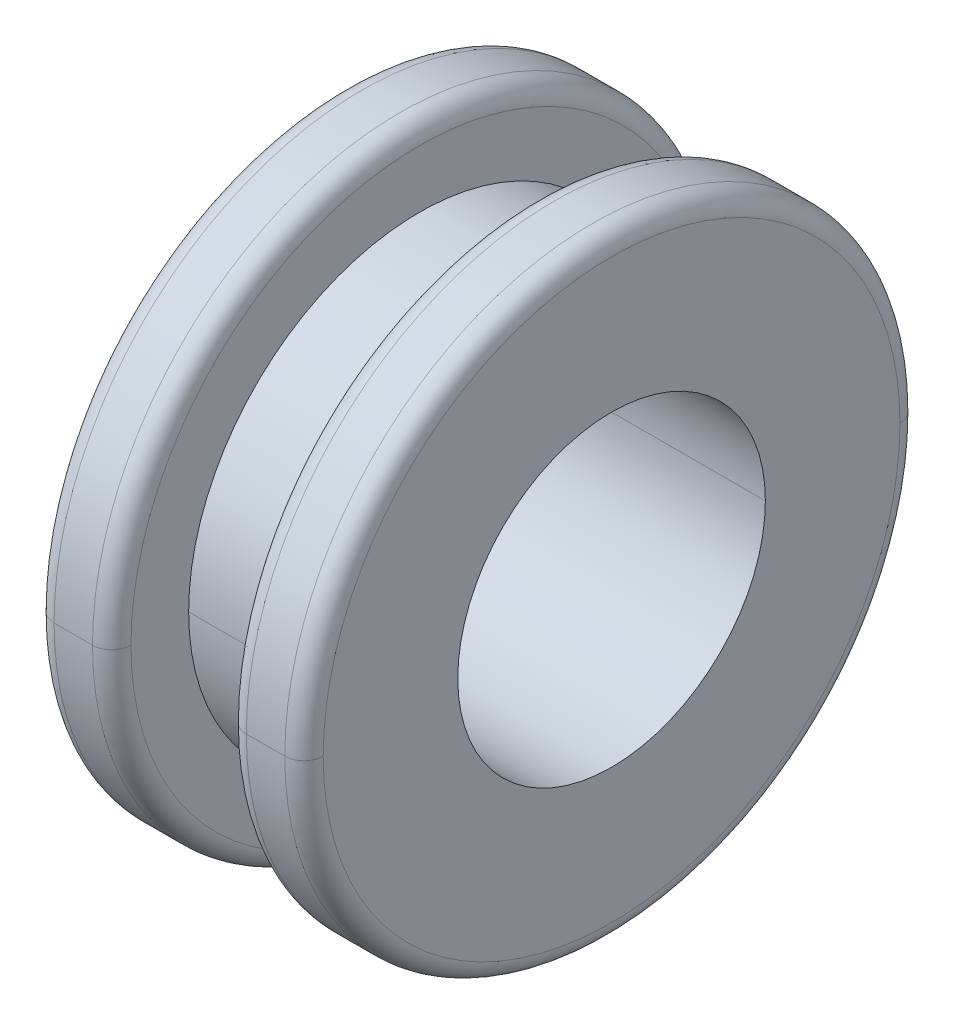
ISO-10303-21;
HEADER;
FILE_DESCRIPTION(('STEP AP214'),'2;1');
FILE_NAME('part.step','',(''),(''),'','','');
FILE_SCHEMA(('AUTOMOTIVE_DESIGN { 1 0 10303 214 1 1 1 1 }'));
ENDSEC;
DATA;
#1=APPLICATION_CONTEXT('core data for automotive mechanical design processes');
#2=APPLICATION_PROTOCOL_DEFINITION('international standard','automotive_design',2000,#1);
#3=PRODUCT_CONTEXT('',#1,'mechanical');
#4=PRODUCT('Part','Part','',(#3));
#5=PRODUCT_RELATED_PRODUCT_CATEGORY('part','',(#4));
#6=PRODUCT_DEFINITION_FORMATION('','',#4);
#7=PRODUCT_DEFINITION_CONTEXT('part definition',#1,'design');
#8=PRODUCT_DEFINITION('design','',#6,#7);
#9=PRODUCT_DEFINITION_SHAPE('','',#8);
#10=(LENGTH_UNIT() NAMED_UNIT(*) SI_UNIT(.MILLI.,.METRE.));
#11=(NAMED_UNIT(*) PLANE_ANGLE_UNIT() SI_UNIT($,.RADIAN.));
#12=(NAMED_UNIT(*) SI_UNIT($,.STERADIAN.) SOLID_ANGLE_UNIT());
#13=UNCERTAINTY_MEASURE_WITH_UNIT(LENGTH_MEASURE(1.E-05),#10,'distance_accuracy_value','');
#14=(GEOMETRIC_REPRESENTATION_CONTEXT(3) GLOBAL_UNCERTAINTY_ASSIGNED_CONTEXT((#13)) GLOBAL_UNIT_ASSIGNED_CONTEXT((#10,
#11,#12)) REPRESENTATION_CONTEXT('',''));
#15=CARTESIAN_POINT('',(0.,0.,0.));
#16=DIRECTION('',(0.,0.,1.));
#17=DIRECTION('',(1.,0.,0.));
#18=AXIS2_PLACEMENT_3D('',#15,#16,#17);
#19=CARTESIAN_POINT('',(3.5,0.,0.));
#20=DIRECTION('',(-1.,0.,0.));
#21=DIRECTION('',(0.,0.,1.));
#22=AXIS2_PLACEMENT_3D('',#19,#20,#21);
#23=CYLINDRICAL_SURFACE('',#22,4.);
#24=DIRECTION('',(-1.,0.,0.));
#25=VECTOR('',#24,1.);
#26=CARTESIAN_POINT('',(3.5,0.,-4.));
#27=LINE('',#26,#25);
#28=CARTESIAN_POINT('',(3.5,0.,-4.));
#29=VERTEX_POINT('',#28);
#30=CARTESIAN_POINT('',(-3.5,0.,-4.));
#31=VERTEX_POINT('',#30);
#32=EDGE_CURVE('E208',#29,#31,#27,.T.);
#33=ORIENTED_EDGE('',*,*,#32,.F.);
#34=CARTESIAN_POINT('',(3.5,0.,0.));
#35=DIRECTION('',(-1.,0.,0.));
#36=DIRECTION('',(0.,0.,1.));
#37=AXIS2_PLACEMENT_3D('',#34,#35,#36);
#38=CIRCLE('',#37,4.);
#39=CARTESIAN_POINT('',(3.5,0.,4.));
#40=VERTEX_POINT('',#39);
#41=EDGE_CURVE('E197',#40,#29,#38,.T.);
#42=ORIENTED_EDGE('',*,*,#41,.F.);
#43=DIRECTION('',(-1.,0.,0.));
#44=VECTOR('',#43,1.);
#45=CARTESIAN_POINT('',(3.5,0.,4.));
#46=LINE('',#45,#44);
#47=CARTESIAN_POINT('',(-3.5,0.,4.));
#48=VERTEX_POINT('',#47);
#49=EDGE_CURVE('E216',#40,#48,#46,.T.);
#50=ORIENTED_EDGE('',*,*,#49,.T.);
#51=CARTESIAN_POINT('',(-3.5,0.,0.));
#52=DIRECTION('',(-1.,0.,0.));
#53=DIRECTION('',(0.,0.,1.));
#54=AXIS2_PLACEMENT_3D('',#51,#52,#53);
#55=CIRCLE('',#54,4.);
#56=EDGE_CURVE('E196',#48,#31,#55,.T.);
#57=ORIENTED_EDGE('',*,*,#56,.T.);
#58=EDGE_LOOP('',(#33,#42,#50,#57));
#59=FACE_BOUND('',#58,.T.);
#60=ADVANCED_FACE('F16',(#59),#23,.F.);
#61=CARTESIAN_POINT('',(3.,0.,0.));
#62=DIRECTION('',(-1.,0.,0.));
#63=DIRECTION('',(0.,0.,1.));
#64=AXIS2_PLACEMENT_3D('',#61,#62,#63);
#65=TOROIDAL_SURFACE('',#64,7.5,0.5);
#66=CARTESIAN_POINT('',(3.,0.,-7.5));
#67=DIRECTION('',(0.,1.,0.));
#68=DIRECTION('',(0.,0.,1.));
#69=AXIS2_PLACEMENT_3D('',#66,#67,#68);
#70=CIRCLE('',#69,0.5);
#71=CARTESIAN_POINT('',(3.5,0.,-7.5));
#72=VERTEX_POINT('',#71);
#73=CARTESIAN_POINT('',(3.,0.,-8.));
#74=VERTEX_POINT('',#73);
#75=EDGE_CURVE('E266',#72,#74,#70,.T.);
#76=ORIENTED_EDGE('',*,*,#75,.F.);
#77=CARTESIAN_POINT('',(3.5,0.,0.));
#78=DIRECTION('',(1.,0.,0.));
#79=DIRECTION('',(0.,0.,1.));
#80=AXIS2_PLACEMENT_3D('',#77,#78,#79);
#81=CIRCLE('',#80,7.5);
#82=CARTESIAN_POINT('',(3.5,0.,7.5));
#83=VERTEX_POINT('',#82);
#84=EDGE_CURVE('E240',#83,#72,#81,.T.);
#85=ORIENTED_EDGE('',*,*,#84,.F.);
#86=CARTESIAN_POINT('',(3.,0.,7.5));
#87=DIRECTION('',(0.,-1.,0.));
#88=DIRECTION('',(0.,0.,-1.));
#89=AXIS2_PLACEMENT_3D('',#86,#87,#88);
#90=CIRCLE('',#89,0.5);
#91=CARTESIAN_POINT('',(3.,0.,8.));
#92=VERTEX_POINT('',#91);
#93=EDGE_CURVE('E265',#83,#92,#90,.T.);
#94=ORIENTED_EDGE('',*,*,#93,.T.);
#95=CARTESIAN_POINT('',(3.,0.,0.));
#96=DIRECTION('',(-1.,0.,0.));
#97=DIRECTION('',(0.,0.,1.));
#98=AXIS2_PLACEMENT_3D('',#95,#96,#97);
#99=CIRCLE('',#98,8.);
#100=EDGE_CURVE('E26',#74,#92,#99,.T.);
#101=ORIENTED_EDGE('',*,*,#100,.F.);
#102=EDGE_LOOP('',(#76,#85,#94,#101));
#103=FACE_BOUND('',#102,.T.);
#104=ADVANCED_FACE('F576',(#103),#65,.T.);
#105=CARTESIAN_POINT('',(2.,0.,0.));
#106=DIRECTION('',(1.,0.,0.));
#107=DIRECTION('',(0.,0.,-1.));
#108=AXIS2_PLACEMENT_3D('',#105,#106,#107);
#109=TOROIDAL_SURFACE('',#108,7.5,0.5);
#110=CARTESIAN_POINT('',(2.,0.,7.5));
#111=DIRECTION('',(0.,1.,0.));
#112=DIRECTION('',(0.,0.,1.));
#113=AXIS2_PLACEMENT_3D('',#110,#111,#112);
#114=CIRCLE('',#113,0.5);
#115=CARTESIAN_POINT('',(1.5,0.,7.5));
#116=VERTEX_POINT('',#115);
#117=CARTESIAN_POINT('',(2.,0.,8.));
#118=VERTEX_POINT('',#117);
#119=EDGE_CURVE('E173',#116,#118,#114,.T.);
#120=ORIENTED_EDGE('',*,*,#119,.F.);
#121=CARTESIAN_POINT('',(1.5,0.,0.));
#122=DIRECTION('',(-1.,0.,0.));
#123=DIRECTION('',(0.,0.,-1.));
#124=AXIS2_PLACEMENT_3D('',#121,#122,#123);
#125=CIRCLE('',#124,7.5);
#126=CARTESIAN_POINT('',(1.5,0.,-7.5));
#127=VERTEX_POINT('',#126);
#128=EDGE_CURVE('E165',#127,#116,#125,.T.);
#129=ORIENTED_EDGE('',*,*,#128,.F.);
#130=CARTESIAN_POINT('',(2.,0.,-7.5));
#131=DIRECTION('',(0.,-1.,0.));
#132=DIRECTION('',(0.,0.,-1.));
#133=AXIS2_PLACEMENT_3D('',#130,#131,#132);
#134=CIRCLE('',#133,0.5);
#135=CARTESIAN_POINT('',(2.,0.,-8.));
#136=VERTEX_POINT('',#135);
#137=EDGE_CURVE('E163',#127,#136,#134,.T.);
#138=ORIENTED_EDGE('',*,*,#137,.T.);
#139=CARTESIAN_POINT('',(2.,0.,0.));
#140=DIRECTION('',(1.,0.,0.));
#141=DIRECTION('',(0.,0.,-1.));
#142=AXIS2_PLACEMENT_3D('',#139,#140,#141);
#143=CIRCLE('',#142,8.);
#144=EDGE_CURVE('E10',#118,#136,#143,.T.);
#145=ORIENTED_EDGE('',*,*,#144,.F.);
#146=EDGE_LOOP('',(#120,#129,#138,#145));
#147=FACE_BOUND('',#146,.T.);
#148=ADVANCED_FACE('F164',(#147),#109,.T.);
#149=CARTESIAN_POINT('',(-2.,0.,0.));
#150=DIRECTION('',(-1.,0.,0.));
#151=DIRECTION('',(0.,0.,1.));
#152=AXIS2_PLACEMENT_3D('',#149,#150,#151);
#153=TOROIDAL_SURFACE('',#152,7.5,0.5);
#154=CARTESIAN_POINT('',(-2.,0.,-7.5));
#155=DIRECTION('',(0.,1.,0.));
#156=DIRECTION('',(0.,0.,1.));
#157=AXIS2_PLACEMENT_3D('',#154,#155,#156);
#158=CIRCLE('',#157,0.5);
#159=CARTESIAN_POINT('',(-1.5,0.,-7.5));
#160=VERTEX_POINT('',#159);
#161=CARTESIAN_POINT('',(-2.,0.,-8.));
#162=VERTEX_POINT('',#161);
#163=EDGE_CURVE('E253',#160,#162,#158,.T.);
#164=ORIENTED_EDGE('',*,*,#163,.F.);
#165=CARTESIAN_POINT('',(-1.5,0.,0.));
#166=DIRECTION('',(1.,0.,0.));
#167=DIRECTION('',(0.,0.,1.));
#168=AXIS2_PLACEMENT_3D('',#165,#166,#167);
#169=CIRCLE('',#168,7.5);
#170=CARTESIAN_POINT('',(-1.5,0.,7.5));
#171=VERTEX_POINT('',#170);
#172=EDGE_CURVE('E284',#171,#160,#169,.T.);
#173=ORIENTED_EDGE('',*,*,#172,.F.);
#174=CARTESIAN_POINT('',(-2.,0.,7.5));
#175=DIRECTION('',(0.,-1.,0.));
#176=DIRECTION('',(0.,0.,-1.));
#177=AXIS2_PLACEMENT_3D('',#174,#175,#176);
#178=CIRCLE('',#177,0.5);
#179=CARTESIAN_POINT('',(-2.,0.,8.));
#180=VERTEX_POINT('',#179);
#181=EDGE_CURVE('E183',#171,#180,#178,.T.);
#182=ORIENTED_EDGE('',*,*,#181,.T.);
#183=CARTESIAN_POINT('',(-2.,0.,0.));
#184=DIRECTION('',(-1.,0.,0.));
#185=DIRECTION('',(0.,0.,1.));
#186=AXIS2_PLACEMENT_3D('',#183,#184,#185);
#187=CIRCLE('',#186,8.);
#188=EDGE_CURVE('E203',#162,#180,#187,.T.);
#189=ORIENTED_EDGE('',*,*,#188,.F.);
#190=EDGE_LOOP('',(#164,#173,#182,#189));
#191=FACE_BOUND('',#190,.T.);
#192=ADVANCED_FACE('F604',(#191),#153,.T.);
#193=CARTESIAN_POINT('',(-3.,0.,0.));
#194=DIRECTION('',(1.,0.,0.));
#195=DIRECTION('',(0.,0.,-1.));
#196=AXIS2_PLACEMENT_3D('',#193,#194,#195);
#197=TOROIDAL_SURFACE('',#196,7.5,0.5);
#198=CARTESIAN_POINT('',(-3.,0.,7.5));
#199=DIRECTION('',(0.,1.,0.));
#200=DIRECTION('',(0.,0.,1.));
#201=AXIS2_PLACEMENT_3D('',#198,#199,#200);
#202=CIRCLE('',#201,0.5);
#203=CARTESIAN_POINT('',(-3.5,0.,7.5));
#204=VERTEX_POINT('',#203);
#205=CARTESIAN_POINT('',(-3.,0.,8.));
#206=VERTEX_POINT('',#205);
#207=EDGE_CURVE('E222',#204,#206,#202,.T.);
#208=ORIENTED_EDGE('',*,*,#207,.F.);
#209=CARTESIAN_POINT('',(-3.5,0.,0.));
#210=DIRECTION('',(-1.,0.,0.));
#211=DIRECTION('',(0.,0.,-1.));
#212=AXIS2_PLACEMENT_3D('',#209,#210,#211);
#213=CIRCLE('',#212,7.5);
#214=CARTESIAN_POINT('',(-3.5,0.,-7.5));
#215=VERTEX_POINT('',#214);
#216=EDGE_CURVE('E125',#215,#204,#213,.T.);
#217=ORIENTED_EDGE('',*,*,#216,.F.);
#218=CARTESIAN_POINT('',(-3.,0.,-7.5));
#219=DIRECTION('',(0.,-1.,0.));
#220=DIRECTION('',(0.,0.,-1.));
#221=AXIS2_PLACEMENT_3D('',#218,#219,#220);
#222=CIRCLE('',#221,0.5);
#223=CARTESIAN_POINT('',(-3.,0.,-8.));
#224=VERTEX_POINT('',#223);
#225=EDGE_CURVE('E160',#215,#224,#222,.T.);
#226=ORIENTED_EDGE('',*,*,#225,.T.);
#227=CARTESIAN_POINT('',(-3.,0.,0.));
#228=DIRECTION('',(1.,0.,0.));
#229=DIRECTION('',(0.,0.,-1.));
#230=AXIS2_PLACEMENT_3D('',#227,#228,#229);
#231=CIRCLE('',#230,8.);
#232=EDGE_CURVE('E286',#206,#224,#231,.T.);
#233=ORIENTED_EDGE('',*,*,#232,.F.);
#234=EDGE_LOOP('',(#208,#217,#226,#233));
#235=FACE_BOUND('',#234,.T.);
#236=ADVANCED_FACE('F311',(#235),#197,.T.);
#237=CARTESIAN_POINT('',(-3.5,0.,0.));
#238=DIRECTION('',(-1.,0.,0.));
#239=DIRECTION('',(0.,0.,1.));
#240=AXIS2_PLACEMENT_3D('',#237,#238,#239);
#241=CYLINDRICAL_SURFACE('',#240,8.);
#242=DIRECTION('',(-1.,0.,0.));
#243=VECTOR('',#242,1.);
#244=CARTESIAN_POINT('',(-3.5,0.,-8.));
#245=LINE('',#244,#243);
#246=EDGE_CURVE('E143',#74,#136,#245,.T.);
#247=ORIENTED_EDGE('',*,*,#246,.F.);
#248=ORIENTED_EDGE('',*,*,#100,.T.);
#249=DIRECTION('',(-1.,0.,0.));
#250=VECTOR('',#249,1.);
#251=CARTESIAN_POINT('',(-3.5,0.,8.));
#252=LINE('',#251,#250);
#253=EDGE_CURVE('E146',#92,#118,#252,.T.);
#254=ORIENTED_EDGE('',*,*,#253,.T.);
#255=ORIENTED_EDGE('',*,*,#144,.T.);
#256=EDGE_LOOP('',(#247,#248,#254,#255));
#257=FACE_BOUND('',#256,.T.);
#258=ADVANCED_FACE('F141',(#257),#241,.T.);
#259=CARTESIAN_POINT('',(1.5,6.,0.));
#260=DIRECTION('',(1.,0.,0.));
#261=DIRECTION('',(0.,1.,0.));
#262=AXIS2_PLACEMENT_3D('',#259,#260,#261);
#263=PLANE('',#262);
#264=CARTESIAN_POINT('',(1.5,0.,0.));
#265=DIRECTION('',(-1.,0.,0.));
#266=DIRECTION('',(0.,0.,1.));
#267=AXIS2_PLACEMENT_3D('',#264,#265,#266);
#268=CIRCLE('',#267,6.);
#269=CARTESIAN_POINT('',(1.5,0.,6.));
#270=VERTEX_POINT('',#269);
#271=CARTESIAN_POINT('',(1.5,0.,-6.));
#272=VERTEX_POINT('',#271);
#273=EDGE_CURVE('E212',#270,#272,#268,.T.);
#274=ORIENTED_EDGE('',*,*,#273,.F.);
#275=CARTESIAN_POINT('',(1.5,0.,0.));
#276=DIRECTION('',(-1.,0.,0.));
#277=DIRECTION('',(0.,0.,1.));
#278=AXIS2_PLACEMENT_3D('',#275,#276,#277);
#279=CIRCLE('',#278,6.);
#280=EDGE_CURVE('E229',#272,#270,#279,.T.);
#281=ORIENTED_EDGE('',*,*,#280,.F.);
#282=EDGE_LOOP('',(#274,#281));
#283=FACE_BOUND('',#282,.T.);
#284=ORIENTED_EDGE('',*,*,#128,.T.);
#285=CARTESIAN_POINT('',(1.5,0.,0.));
#286=DIRECTION('',(-1.,0.,0.));
#287=DIRECTION('',(0.,0.,-1.));
#288=AXIS2_PLACEMENT_3D('',#285,#286,#287);
#289=CIRCLE('',#288,7.5);
#290=EDGE_CURVE('E179',#116,#127,#289,.T.);
#291=ORIENTED_EDGE('',*,*,#290,.T.);
#292=EDGE_LOOP('',(#284,#291));
#293=FACE_BOUND('',#292,.T.);
#294=ADVANCED_FACE('F565',(#283,#293),#263,.F.);
#295=CARTESIAN_POINT('',(-3.5,0.,0.));
#296=DIRECTION('',(-1.,0.,0.));
#297=DIRECTION('',(0.,0.,1.));
#298=AXIS2_PLACEMENT_3D('',#295,#296,#297);
#299=CYLINDRICAL_SURFACE('',#298,6.);
#300=DIRECTION('',(-1.,0.,0.));
#301=VECTOR('',#300,1.);
#302=CARTESIAN_POINT('',(-3.5,0.,-6.));
#303=LINE('',#302,#301);
#304=CARTESIAN_POINT('',(-1.5,0.,-6.));
#305=VERTEX_POINT('',#304);
#306=EDGE_CURVE('E193',#272,#305,#303,.T.);
#307=ORIENTED_EDGE('',*,*,#306,.F.);
#308=ORIENTED_EDGE('',*,*,#280,.T.);
#309=DIRECTION('',(-1.,0.,0.));
#310=VECTOR('',#309,1.);
#311=CARTESIAN_POINT('',(-3.5,0.,6.));
#312=LINE('',#311,#310);
#313=CARTESIAN_POINT('',(-1.5,0.,6.));
#314=VERTEX_POINT('',#313);
#315=EDGE_CURVE('E192',#270,#314,#312,.T.);
#316=ORIENTED_EDGE('',*,*,#315,.T.);
#317=CARTESIAN_POINT('',(-1.5,0.,0.));
#318=DIRECTION('',(-1.,0.,0.));
#319=DIRECTION('',(0.,0.,1.));
#320=AXIS2_PLACEMENT_3D('',#317,#318,#319);
#321=CIRCLE('',#320,6.);
#322=EDGE_CURVE('E39',#305,#314,#321,.T.);
#323=ORIENTED_EDGE('',*,*,#322,.F.);
#324=EDGE_LOOP('',(#307,#308,#316,#323));
#325=FACE_BOUND('',#324,.T.);
#326=ADVANCED_FACE('F559',(#325),#299,.T.);
#327=CARTESIAN_POINT('',(-1.5,8.,0.));
#328=DIRECTION('',(-1.,0.,0.));
#329=DIRECTION('',(0.,0.,1.));
#330=AXIS2_PLACEMENT_3D('',#327,#328,#329);
#331=PLANE('',#330);
#332=CARTESIAN_POINT('',(-1.5,0.,0.));
#333=DIRECTION('',(-1.,0.,0.));
#334=DIRECTION('',(0.,0.,1.));
#335=AXIS2_PLACEMENT_3D('',#332,#333,#334);
#336=CIRCLE('',#335,6.);
#337=EDGE_CURVE('E189',#314,#305,#336,.T.);
#338=ORIENTED_EDGE('',*,*,#337,.T.);
#339=ORIENTED_EDGE('',*,*,#322,.T.);
#340=EDGE_LOOP('',(#338,#339));
#341=FACE_BOUND('',#340,.T.);
#342=ORIENTED_EDGE('',*,*,#172,.T.);
#343=CARTESIAN_POINT('',(-1.5,0.,0.));
#344=DIRECTION('',(1.,0.,0.));
#345=DIRECTION('',(0.,0.,1.));
#346=AXIS2_PLACEMENT_3D('',#343,#344,#345);
#347=CIRCLE('',#346,7.5);
#348=EDGE_CURVE('E170',#160,#171,#347,.T.);
#349=ORIENTED_EDGE('',*,*,#348,.T.);
#350=EDGE_LOOP('',(#342,#349));
#351=FACE_BOUND('',#350,.T.);
#352=ADVANCED_FACE('F564',(#341,#351),#331,.F.);
#353=CARTESIAN_POINT('',(-3.5,0.,0.));
#354=DIRECTION('',(-1.,0.,0.));
#355=DIRECTION('',(0.,0.,1.));
#356=AXIS2_PLACEMENT_3D('',#353,#354,#355);
#357=CYLINDRICAL_SURFACE('',#356,8.);
#358=DIRECTION('',(-1.,0.,0.));
#359=VECTOR('',#358,1.);
#360=CARTESIAN_POINT('',(-3.5,0.,-8.));
#361=LINE('',#360,#359);
#362=EDGE_CURVE('E200',#162,#224,#361,.T.);
#363=ORIENTED_EDGE('',*,*,#362,.F.);
#364=ORIENTED_EDGE('',*,*,#188,.T.);
#365=DIRECTION('',(-1.,0.,0.));
#366=VECTOR('',#365,1.);
#367=CARTESIAN_POINT('',(-3.5,0.,8.));
#368=LINE('',#367,#366);
#369=EDGE_CURVE('E234',#180,#206,#368,.T.);
#370=ORIENTED_EDGE('',*,*,#369,.T.);
#371=ORIENTED_EDGE('',*,*,#232,.T.);
#372=EDGE_LOOP('',(#363,#364,#370,#371));
#373=FACE_BOUND('',#372,.T.);
#374=ADVANCED_FACE('F18',(#373),#357,.T.);
#375=CARTESIAN_POINT('',(-3.5,0.,0.));
#376=DIRECTION('',(1.,0.,0.));
#377=DIRECTION('',(0.,1.,0.));
#378=AXIS2_PLACEMENT_3D('',#375,#376,#377);
#379=PLANE('',#378);
#380=ORIENTED_EDGE('',*,*,#56,.F.);
#381=CARTESIAN_POINT('',(-3.5,0.,0.));
#382=DIRECTION('',(-1.,0.,0.));
#383=DIRECTION('',(0.,0.,1.));
#384=AXIS2_PLACEMENT_3D('',#381,#382,#383);
#385=CIRCLE('',#384,4.);
#386=EDGE_CURVE('E221',#31,#48,#385,.T.);
#387=ORIENTED_EDGE('',*,*,#386,.F.);
#388=EDGE_LOOP('',(#380,#387));
#389=FACE_BOUND('',#388,.T.);
#390=ORIENTED_EDGE('',*,*,#216,.T.);
#391=CARTESIAN_POINT('',(-3.5,0.,0.));
#392=DIRECTION('',(-1.,0.,0.));
#393=DIRECTION('',(0.,0.,-1.));
#394=AXIS2_PLACEMENT_3D('',#391,#392,#393);
#395=CIRCLE('',#394,7.5);
#396=EDGE_CURVE('E187',#204,#215,#395,.T.);
#397=ORIENTED_EDGE('',*,*,#396,.T.);
#398=EDGE_LOOP('',(#390,#397));
#399=FACE_BOUND('',#398,.T.);
#400=ADVANCED_FACE('F307',(#389,#399),#379,.F.);
#401=CARTESIAN_POINT('',(3.5,8.,0.));
#402=DIRECTION('',(-1.,0.,0.));
#403=DIRECTION('',(0.,0.,1.));
#404=AXIS2_PLACEMENT_3D('',#401,#402,#403);
#405=PLANE('',#404);
#406=ORIENTED_EDGE('',*,*,#41,.T.);
#407=CARTESIAN_POINT('',(3.5,0.,0.));
#408=DIRECTION('',(-1.,0.,0.));
#409=DIRECTION('',(0.,0.,1.));
#410=AXIS2_PLACEMENT_3D('',#407,#408,#409);
#411=CIRCLE('',#410,4.);
#412=EDGE_CURVE('E204',#29,#40,#411,.T.);
#413=ORIENTED_EDGE('',*,*,#412,.T.);
#414=EDGE_LOOP('',(#406,#413));
#415=FACE_BOUND('',#414,.T.);
#416=ORIENTED_EDGE('',*,*,#84,.T.);
#417=CARTESIAN_POINT('',(3.5,0.,0.));
#418=DIRECTION('',(1.,0.,0.));
#419=DIRECTION('',(0.,0.,1.));
#420=AXIS2_PLACEMENT_3D('',#417,#418,#419);
#421=CIRCLE('',#420,7.5);
#422=EDGE_CURVE('E220',#72,#83,#421,.T.);
#423=ORIENTED_EDGE('',*,*,#422,.T.);
#424=EDGE_LOOP('',(#416,#423));
#425=FACE_BOUND('',#424,.T.);
#426=ADVANCED_FACE('F682',(#415,#425),#405,.F.);
#427=CARTESIAN_POINT('',(-3.5,0.,0.));
#428=DIRECTION('',(-1.,0.,0.));
#429=DIRECTION('',(0.,0.,1.));
#430=AXIS2_PLACEMENT_3D('',#427,#428,#429);
#431=CYLINDRICAL_SURFACE('',#430,8.);
#432=CARTESIAN_POINT('',(-2.,0.,0.));
#433=DIRECTION('',(-1.,0.,0.));
#434=DIRECTION('',(0.,0.,1.));
#435=AXIS2_PLACEMENT_3D('',#432,#433,#434);
#436=CIRCLE('',#435,8.);
#437=EDGE_CURVE('E188',#180,#162,#436,.T.);
#438=ORIENTED_EDGE('',*,*,#437,.T.);
#439=ORIENTED_EDGE('',*,*,#362,.T.);
#440=CARTESIAN_POINT('',(-3.,0.,0.));
#441=DIRECTION('',(1.,0.,0.));
#442=DIRECTION('',(0.,0.,-1.));
#443=AXIS2_PLACEMENT_3D('',#440,#441,#442);
#444=CIRCLE('',#443,8.);
#445=EDGE_CURVE('E211',#224,#206,#444,.T.);
#446=ORIENTED_EDGE('',*,*,#445,.T.);
#447=ORIENTED_EDGE('',*,*,#369,.F.);
#448=EDGE_LOOP('',(#438,#439,#446,#447));
#449=FACE_BOUND('',#448,.T.);
#450=ADVANCED_FACE('F314',(#449),#431,.T.);
#451=CARTESIAN_POINT('',(-3.5,0.,0.));
#452=DIRECTION('',(-1.,0.,0.));
#453=DIRECTION('',(0.,0.,1.));
#454=AXIS2_PLACEMENT_3D('',#451,#452,#453);
#455=CYLINDRICAL_SURFACE('',#454,6.);
#456=ORIENTED_EDGE('',*,*,#273,.T.);
#457=ORIENTED_EDGE('',*,*,#306,.T.);
#458=ORIENTED_EDGE('',*,*,#337,.F.);
#459=ORIENTED_EDGE('',*,*,#315,.F.);
#460=EDGE_LOOP('',(#456,#457,#458,#459));
#461=FACE_BOUND('',#460,.T.);
#462=ADVANCED_FACE('F631',(#461),#455,.T.);
#463=CARTESIAN_POINT('',(-3.5,0.,0.));
#464=DIRECTION('',(-1.,0.,0.));
#465=DIRECTION('',(0.,0.,1.));
#466=AXIS2_PLACEMENT_3D('',#463,#464,#465);
#467=CYLINDRICAL_SURFACE('',#466,8.);
#468=CARTESIAN_POINT('',(3.,0.,0.));
#469=DIRECTION('',(-1.,0.,0.));
#470=DIRECTION('',(0.,0.,1.));
#471=AXIS2_PLACEMENT_3D('',#468,#469,#470);
#472=CIRCLE('',#471,8.);
#473=EDGE_CURVE('E157',#92,#74,#472,.T.);
#474=ORIENTED_EDGE('',*,*,#473,.T.);
#475=ORIENTED_EDGE('',*,*,#246,.T.);
#476=CARTESIAN_POINT('',(2.,0.,0.));
#477=DIRECTION('',(1.,0.,0.));
#478=DIRECTION('',(0.,0.,-1.));
#479=AXIS2_PLACEMENT_3D('',#476,#477,#478);
#480=CIRCLE('',#479,8.);
#481=EDGE_CURVE('E154',#136,#118,#480,.T.);
#482=ORIENTED_EDGE('',*,*,#481,.T.);
#483=ORIENTED_EDGE('',*,*,#253,.F.);
#484=EDGE_LOOP('',(#474,#475,#482,#483));
#485=FACE_BOUND('',#484,.T.);
#486=ADVANCED_FACE('F152',(#485),#467,.T.);
#487=CARTESIAN_POINT('',(-3.,0.,0.));
#488=DIRECTION('',(1.,0.,0.));
#489=DIRECTION('',(0.,0.,-1.));
#490=AXIS2_PLACEMENT_3D('',#487,#488,#489);
#491=TOROIDAL_SURFACE('',#490,7.5,0.5);
#492=ORIENTED_EDGE('',*,*,#396,.F.);
#493=ORIENTED_EDGE('',*,*,#207,.T.);
#494=ORIENTED_EDGE('',*,*,#445,.F.);
#495=ORIENTED_EDGE('',*,*,#225,.F.);
#496=EDGE_LOOP('',(#492,#493,#494,#495));
#497=FACE_BOUND('',#496,.T.);
#498=ADVANCED_FACE('F309',(#497),#491,.T.);
#499=CARTESIAN_POINT('',(-2.,0.,0.));
#500=DIRECTION('',(-1.,0.,0.));
#501=DIRECTION('',(0.,0.,1.));
#502=AXIS2_PLACEMENT_3D('',#499,#500,#501);
#503=TOROIDAL_SURFACE('',#502,7.5,0.5);
#504=ORIENTED_EDGE('',*,*,#348,.F.);
#505=ORIENTED_EDGE('',*,*,#163,.T.);
#506=ORIENTED_EDGE('',*,*,#437,.F.);
#507=ORIENTED_EDGE('',*,*,#181,.F.);
#508=EDGE_LOOP('',(#504,#505,#506,#507));
#509=FACE_BOUND('',#508,.T.);
#510=ADVANCED_FACE('F320',(#509),#503,.T.);
#511=CARTESIAN_POINT('',(2.,0.,0.));
#512=DIRECTION('',(1.,0.,0.));
#513=DIRECTION('',(0.,0.,-1.));
#514=AXIS2_PLACEMENT_3D('',#511,#512,#513);
#515=TOROIDAL_SURFACE('',#514,7.5,0.5);
#516=ORIENTED_EDGE('',*,*,#290,.F.);
#517=ORIENTED_EDGE('',*,*,#119,.T.);
#518=ORIENTED_EDGE('',*,*,#481,.F.);
#519=ORIENTED_EDGE('',*,*,#137,.F.);
#520=EDGE_LOOP('',(#516,#517,#518,#519));
#521=FACE_BOUND('',#520,.T.);
#522=ADVANCED_FACE('F172',(#521),#515,.T.);
#523=CARTESIAN_POINT('',(3.,0.,0.));
#524=DIRECTION('',(-1.,0.,0.));
#525=DIRECTION('',(0.,0.,1.));
#526=AXIS2_PLACEMENT_3D('',#523,#524,#525);
#527=TOROIDAL_SURFACE('',#526,7.5,0.5);
#528=ORIENTED_EDGE('',*,*,#422,.F.);
#529=ORIENTED_EDGE('',*,*,#75,.T.);
#530=ORIENTED_EDGE('',*,*,#473,.F.);
#531=ORIENTED_EDGE('',*,*,#93,.F.);
#532=EDGE_LOOP('',(#528,#529,#530,#531));
#533=FACE_BOUND('',#532,.T.);
#534=ADVANCED_FACE('F595',(#533),#527,.T.);
#535=CARTESIAN_POINT('',(3.5,0.,0.));
#536=DIRECTION('',(-1.,0.,0.));
#537=DIRECTION('',(0.,0.,1.));
#538=AXIS2_PLACEMENT_3D('',#535,#536,#537);
#539=CYLINDRICAL_SURFACE('',#538,4.);
#540=ORIENTED_EDGE('',*,*,#412,.F.);
#541=ORIENTED_EDGE('',*,*,#32,.T.);
#542=ORIENTED_EDGE('',*,*,#386,.T.);
#543=ORIENTED_EDGE('',*,*,#49,.F.);
#544=EDGE_LOOP('',(#540,#541,#542,#543));
#545=FACE_BOUND('',#544,.T.);
#546=ADVANCED_FACE('F590',(#545),#539,.F.);
#547=CLOSED_SHELL('',(#60,#104,#148,#192,#236,#258,#294,#326,#352,#374,#400,#426,#450,#462,#486,
#498,#510,#522,#534,#546));
#548=MANIFOLD_SOLID_BREP('B1',#547);
#549=ADVANCED_BREP_SHAPE_REPRESENTATION('',(#18,#548),#14);
#550=SHAPE_DEFINITION_REPRESENTATION(#9,#549);
ENDSEC;
END-ISO-10303-21;
